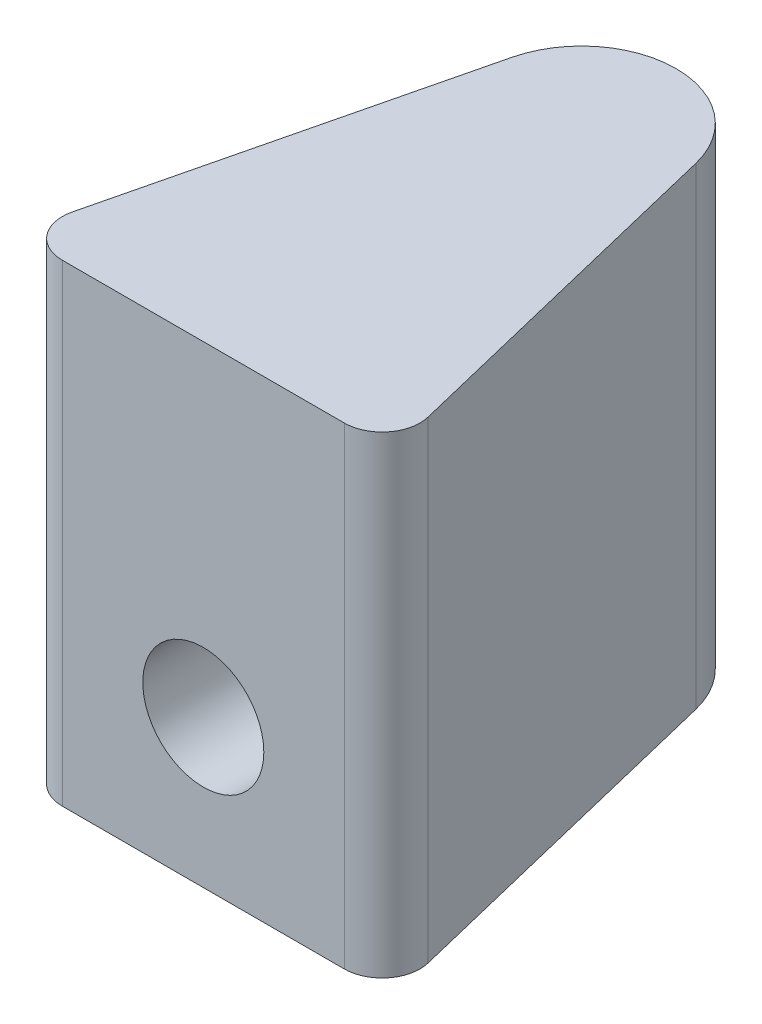
ISO-10303-21;
HEADER;
FILE_DESCRIPTION(('STEP AP214'),'2;1');
FILE_NAME('part.step','',(''),(''),'','','');
FILE_SCHEMA(('AUTOMOTIVE_DESIGN { 1 0 10303 214 1 1 1 1 }'));
ENDSEC;
DATA;
#1=APPLICATION_CONTEXT('core data for automotive mechanical design processes');
#2=APPLICATION_PROTOCOL_DEFINITION('international standard','automotive_design',2000,#1);
#3=PRODUCT_CONTEXT('',#1,'mechanical');
#4=PRODUCT('Part','Part','',(#3));
#5=PRODUCT_RELATED_PRODUCT_CATEGORY('part','',(#4));
#6=PRODUCT_DEFINITION_FORMATION('','',#4);
#7=PRODUCT_DEFINITION_CONTEXT('part definition',#1,'design');
#8=PRODUCT_DEFINITION('design','',#6,#7);
#9=PRODUCT_DEFINITION_SHAPE('','',#8);
#10=(LENGTH_UNIT() NAMED_UNIT(*) SI_UNIT(.MILLI.,.METRE.));
#11=(NAMED_UNIT(*) PLANE_ANGLE_UNIT() SI_UNIT($,.RADIAN.));
#12=(NAMED_UNIT(*) SI_UNIT($,.STERADIAN.) SOLID_ANGLE_UNIT());
#13=UNCERTAINTY_MEASURE_WITH_UNIT(LENGTH_MEASURE(1.E-05),#10,'distance_accuracy_value','');
#14=(GEOMETRIC_REPRESENTATION_CONTEXT(3) GLOBAL_UNCERTAINTY_ASSIGNED_CONTEXT((#13)) GLOBAL_UNIT_ASSIGNED_CONTEXT((#10,
#11,#12)) REPRESENTATION_CONTEXT('',''));
#15=CARTESIAN_POINT('',(0.,0.,0.));
#16=DIRECTION('',(0.,0.,1.));
#17=DIRECTION('',(1.,0.,0.));
#18=AXIS2_PLACEMENT_3D('',#15,#16,#17);
#19=CARTESIAN_POINT('',(0.,25.,0.));
#20=DIRECTION('',(0.,-1.,0.));
#21=DIRECTION('',(0.,0.,-1.));
#22=AXIS2_PLACEMENT_3D('',#19,#20,#21);
#23=CYLINDRICAL_SURFACE('',#22,5.);
#24=CARTESIAN_POINT('',(0.,0.,0.));
#25=DIRECTION('',(0.,1.,0.));
#26=DIRECTION('',(0.,0.,1.));
#27=AXIS2_PLACEMENT_3D('',#24,#25,#26);
#28=CIRCLE('',#27,5.);
#29=CARTESIAN_POINT('',(4.85889894354068,0.,-1.17944947177034));
#30=VERTEX_POINT('',#29);
#31=CARTESIAN_POINT('',(-4.85889894354068,0.,-1.17944947177034));
#32=VERTEX_POINT('',#31);
#33=EDGE_CURVE('E115',#30,#32,#28,.T.);
#34=ORIENTED_EDGE('',*,*,#33,.T.);
#35=DIRECTION('',(0.,-1.,0.));
#36=VECTOR('',#35,1.);
#37=CARTESIAN_POINT('',(-4.85889894354068,25.,-1.17944947177034));
#38=LINE('',#37,#36);
#39=CARTESIAN_POINT('',(-4.85889894354068,25.,-1.17944947177034));
#40=VERTEX_POINT('',#39);
#41=EDGE_CURVE('E96',#40,#32,#38,.T.);
#42=ORIENTED_EDGE('',*,*,#41,.F.);
#43=CARTESIAN_POINT('',(0.,25.,0.));
#44=DIRECTION('',(0.,1.,0.));
#45=DIRECTION('',(0.,0.,1.));
#46=AXIS2_PLACEMENT_3D('',#43,#44,#45);
#47=CIRCLE('',#46,5.);
#48=CARTESIAN_POINT('',(4.85889894354068,25.,-1.17944947177034));
#49=VERTEX_POINT('',#48);
#50=EDGE_CURVE('E102',#49,#40,#47,.T.);
#51=ORIENTED_EDGE('',*,*,#50,.F.);
#52=DIRECTION('',(0.,-1.,0.));
#53=VECTOR('',#52,1.);
#54=CARTESIAN_POINT('',(4.85889894354068,25.,-1.17944947177034));
#55=LINE('',#54,#53);
#56=EDGE_CURVE('E118',#49,#30,#55,.T.);
#57=ORIENTED_EDGE('',*,*,#56,.T.);
#58=EDGE_LOOP('',(#34,#42,#51,#57));
#59=FACE_BOUND('',#58,.T.);
#60=ADVANCED_FACE('F39',(#59),#23,.T.);
#61=CARTESIAN_POINT('',(-4.85889894354068,25.,-1.17944947177034));
#62=DIRECTION('',(0.971779788708135,0.,0.235889894354067));
#63=DIRECTION('',(0.235889894354067,0.,-0.971779788708135));
#64=AXIS2_PLACEMENT_3D('',#61,#62,#63);
#65=PLANE('',#64);
#66=DIRECTION('',(-0.235889894354067,0.,0.971779788708135));
#67=VECTOR('',#66,1.);
#68=CARTESIAN_POINT('',(-4.85889894354068,0.,-1.17944947177034));
#69=LINE('',#68,#67);
#70=CARTESIAN_POINT('',(-9.4,0.,17.5282202112919));
#71=VERTEX_POINT('',#70);
#72=EDGE_CURVE('E158',#32,#71,#69,.T.);
#73=ORIENTED_EDGE('',*,*,#72,.T.);
#74=DIRECTION('',(0.,-1.,0.));
#75=VECTOR('',#74,1.);
#76=CARTESIAN_POINT('',(-9.4,25.,17.5282202112919));
#77=LINE('',#76,#75);
#78=CARTESIAN_POINT('',(-9.4,25.,17.5282202112919));
#79=VERTEX_POINT('',#78);
#80=EDGE_CURVE('E11',#71,#79,#77,.F.);
#81=ORIENTED_EDGE('',*,*,#80,.T.);
#82=DIRECTION('',(-0.235889894354067,0.,0.971779788708135));
#83=VECTOR('',#82,1.);
#84=CARTESIAN_POINT('',(-4.85889894354068,25.,-1.17944947177034));
#85=LINE('',#84,#83);
#86=EDGE_CURVE('E92',#40,#79,#85,.T.);
#87=ORIENTED_EDGE('',*,*,#86,.F.);
#88=ORIENTED_EDGE('',*,*,#41,.T.);
#89=EDGE_LOOP('',(#73,#81,#87,#88));
#90=FACE_BOUND('',#89,.T.);
#91=ADVANCED_FACE('F94',(#90),#65,.F.);
#92=CARTESIAN_POINT('',(-10.,25.,20.));
#93=DIRECTION('',(0.,0.,-1.));
#94=DIRECTION('',(-1.,0.,0.));
#95=AXIS2_PLACEMENT_3D('',#92,#93,#94);
#96=PLANE('',#95);
#97=CARTESIAN_POINT('',(0.,7.8,20.));
#98=DIRECTION('',(0.,0.,1.));
#99=DIRECTION('',(1.,0.,0.));
#100=AXIS2_PLACEMENT_3D('',#97,#98,#99);
#101=CIRCLE('',#100,3.2);
#102=CARTESIAN_POINT('',(3.2,7.8,20.));
#103=VERTEX_POINT('',#102);
#104=EDGE_CURVE('E169',#103,#103,#101,.T.);
#105=ORIENTED_EDGE('',*,*,#104,.F.);
#106=EDGE_LOOP('',(#105));
#107=FACE_BOUND('',#106,.T.);
#108=DIRECTION('',(1.,0.,0.));
#109=VECTOR('',#108,1.);
#110=CARTESIAN_POINT('',(-10.,0.,20.));
#111=LINE('',#110,#109);
#112=CARTESIAN_POINT('',(-7.45644042258373,0.,20.));
#113=VERTEX_POINT('',#112);
#114=CARTESIAN_POINT('',(7.45644042258373,0.,20.));
#115=VERTEX_POINT('',#114);
#116=EDGE_CURVE('E154',#113,#115,#111,.T.);
#117=ORIENTED_EDGE('',*,*,#116,.T.);
#118=DIRECTION('',(0.,-1.,0.));
#119=VECTOR('',#118,1.);
#120=CARTESIAN_POINT('',(7.45644042258373,25.,20.));
#121=LINE('',#120,#119);
#122=CARTESIAN_POINT('',(7.45644042258373,25.,20.));
#123=VERTEX_POINT('',#122);
#124=EDGE_CURVE('E61',#115,#123,#121,.F.);
#125=ORIENTED_EDGE('',*,*,#124,.T.);
#126=DIRECTION('',(1.,0.,0.));
#127=VECTOR('',#126,1.);
#128=CARTESIAN_POINT('',(-10.,25.,20.));
#129=LINE('',#128,#127);
#130=CARTESIAN_POINT('',(-7.45644042258373,25.,20.));
#131=VERTEX_POINT('',#130);
#132=EDGE_CURVE('E101',#131,#123,#129,.T.);
#133=ORIENTED_EDGE('',*,*,#132,.F.);
#134=DIRECTION('',(0.,-1.,0.));
#135=VECTOR('',#134,1.);
#136=CARTESIAN_POINT('',(-7.45644042258373,25.,20.));
#137=LINE('',#136,#135);
#138=EDGE_CURVE('E133',#131,#113,#137,.T.);
#139=ORIENTED_EDGE('',*,*,#138,.T.);
#140=EDGE_LOOP('',(#117,#125,#133,#139));
#141=FACE_BOUND('',#140,.T.);
#142=ADVANCED_FACE('F155',(#107,#141),#96,.F.);
#143=CARTESIAN_POINT('',(10.,25.,20.));
#144=DIRECTION('',(-0.971779788708135,0.,0.235889894354067));
#145=DIRECTION('',(0.235889894354067,0.,0.971779788708135));
#146=AXIS2_PLACEMENT_3D('',#143,#144,#145);
#147=PLANE('',#146);
#148=DIRECTION('',(-0.235889894354067,0.,-0.971779788708135));
#149=VECTOR('',#148,1.);
#150=CARTESIAN_POINT('',(10.,25.,20.));
#151=LINE('',#150,#149);
#152=CARTESIAN_POINT('',(9.4,25.,17.5282202112919));
#153=VERTEX_POINT('',#152);
#154=EDGE_CURVE('E107',#153,#49,#151,.T.);
#155=ORIENTED_EDGE('',*,*,#154,.F.);
#156=DIRECTION('',(0.,-1.,0.));
#157=VECTOR('',#156,1.);
#158=CARTESIAN_POINT('',(9.4,25.,17.5282202112919));
#159=LINE('',#158,#157);
#160=CARTESIAN_POINT('',(9.4,0.,17.5282202112919));
#161=VERTEX_POINT('',#160);
#162=EDGE_CURVE('E117',#153,#161,#159,.T.);
#163=ORIENTED_EDGE('',*,*,#162,.T.);
#164=DIRECTION('',(-0.235889894354067,0.,-0.971779788708135));
#165=VECTOR('',#164,1.);
#166=CARTESIAN_POINT('',(10.,0.,20.));
#167=LINE('',#166,#165);
#168=EDGE_CURVE('E112',#161,#30,#167,.T.);
#169=ORIENTED_EDGE('',*,*,#168,.T.);
#170=ORIENTED_EDGE('',*,*,#56,.F.);
#171=EDGE_LOOP('',(#155,#163,#169,#170));
#172=FACE_BOUND('',#171,.T.);
#173=ADVANCED_FACE('F146',(#172),#147,.F.);
#174=CARTESIAN_POINT('',(0.,25.,0.));
#175=DIRECTION('',(0.,1.,0.));
#176=DIRECTION('',(0.,0.,1.));
#177=AXIS2_PLACEMENT_3D('',#174,#175,#176);
#178=PLANE('',#177);
#179=ORIENTED_EDGE('',*,*,#132,.T.);
#180=CARTESIAN_POINT('',(7.45644042258373,25.,18.));
#181=DIRECTION('',(0.,1.,0.));
#182=DIRECTION('',(0.,0.,1.));
#183=AXIS2_PLACEMENT_3D('',#180,#181,#182);
#184=CIRCLE('',#183,2.);
#185=EDGE_CURVE('E48',#123,#153,#184,.T.);
#186=ORIENTED_EDGE('',*,*,#185,.T.);
#187=ORIENTED_EDGE('',*,*,#154,.T.);
#188=ORIENTED_EDGE('',*,*,#50,.T.);
#189=ORIENTED_EDGE('',*,*,#86,.T.);
#190=CARTESIAN_POINT('',(-7.45644042258373,25.,18.));
#191=DIRECTION('',(0.,1.,0.));
#192=DIRECTION('',(0.,0.,1.));
#193=AXIS2_PLACEMENT_3D('',#190,#191,#192);
#194=CIRCLE('',#193,2.);
#195=EDGE_CURVE('E139',#79,#131,#194,.T.);
#196=ORIENTED_EDGE('',*,*,#195,.T.);
#197=EDGE_LOOP('',(#179,#186,#187,#188,#189,#196));
#198=FACE_BOUND('',#197,.T.);
#199=ADVANCED_FACE('F105',(#198),#178,.T.);
#200=CARTESIAN_POINT('',(0.,0.,0.));
#201=DIRECTION('',(0.,1.,0.));
#202=DIRECTION('',(0.,0.,1.));
#203=AXIS2_PLACEMENT_3D('',#200,#201,#202);
#204=PLANE('',#203);
#205=ORIENTED_EDGE('',*,*,#168,.F.);
#206=CARTESIAN_POINT('',(7.45644042258373,0.,18.));
#207=DIRECTION('',(0.,1.,0.));
#208=DIRECTION('',(0.,0.,1.));
#209=AXIS2_PLACEMENT_3D('',#206,#207,#208);
#210=CIRCLE('',#209,2.);
#211=EDGE_CURVE('E130',#161,#115,#210,.F.);
#212=ORIENTED_EDGE('',*,*,#211,.T.);
#213=ORIENTED_EDGE('',*,*,#116,.F.);
#214=CARTESIAN_POINT('',(-7.45644042258373,0.,18.));
#215=DIRECTION('',(0.,1.,0.));
#216=DIRECTION('',(0.,0.,1.));
#217=AXIS2_PLACEMENT_3D('',#214,#215,#216);
#218=CIRCLE('',#217,2.);
#219=EDGE_CURVE('E123',#113,#71,#218,.F.);
#220=ORIENTED_EDGE('',*,*,#219,.T.);
#221=ORIENTED_EDGE('',*,*,#72,.F.);
#222=ORIENTED_EDGE('',*,*,#33,.F.);
#223=EDGE_LOOP('',(#205,#212,#213,#220,#221,#222));
#224=FACE_BOUND('',#223,.T.);
#225=ADVANCED_FACE('F153',(#224),#204,.F.);
#226=CARTESIAN_POINT('',(0.,7.8,8.));
#227=DIRECTION('',(0.,0.,1.));
#228=DIRECTION('',(1.,0.,0.));
#229=AXIS2_PLACEMENT_3D('',#226,#227,#228);
#230=CYLINDRICAL_SURFACE('',#229,3.2);
#231=CARTESIAN_POINT('',(0.,7.8,8.));
#232=DIRECTION('',(0.,0.,1.));
#233=DIRECTION('',(1.,0.,0.));
#234=AXIS2_PLACEMENT_3D('',#231,#232,#233);
#235=CIRCLE('',#234,3.2);
#236=CARTESIAN_POINT('',(3.2,7.8,8.));
#237=VERTEX_POINT('',#236);
#238=EDGE_CURVE('E165',#237,#237,#235,.T.);
#239=ORIENTED_EDGE('',*,*,#238,.F.);
#240=EDGE_LOOP('',(#239));
#241=FACE_BOUND('',#240,.T.);
#242=ORIENTED_EDGE('',*,*,#104,.T.);
#243=EDGE_LOOP('',(#242));
#244=FACE_BOUND('',#243,.T.);
#245=ADVANCED_FACE('F179',(#241,#244),#230,.F.);
#246=CARTESIAN_POINT('',(0.,7.8,8.));
#247=DIRECTION('',(0.,0.,1.));
#248=DIRECTION('',(1.,0.,0.));
#249=AXIS2_PLACEMENT_3D('',#246,#247,#248);
#250=PLANE('',#249);
#251=ORIENTED_EDGE('',*,*,#238,.T.);
#252=EDGE_LOOP('',(#251));
#253=FACE_BOUND('',#252,.T.);
#254=ADVANCED_FACE('F177',(#253),#250,.T.);
#255=CARTESIAN_POINT('',(7.45644042258373,25.,18.));
#256=DIRECTION('',(0.,-1.,0.));
#257=DIRECTION('',(0.,0.,-1.));
#258=AXIS2_PLACEMENT_3D('',#255,#256,#257);
#259=CYLINDRICAL_SURFACE('',#258,2.);
#260=ORIENTED_EDGE('',*,*,#185,.F.);
#261=ORIENTED_EDGE('',*,*,#124,.F.);
#262=ORIENTED_EDGE('',*,*,#211,.F.);
#263=ORIENTED_EDGE('',*,*,#162,.F.);
#264=EDGE_LOOP('',(#260,#261,#262,#263));
#265=FACE_BOUND('',#264,.T.);
#266=ADVANCED_FACE('F150',(#265),#259,.T.);
#267=CARTESIAN_POINT('',(-7.45644042258373,25.,18.));
#268=DIRECTION('',(0.,-1.,0.));
#269=DIRECTION('',(0.,0.,-1.));
#270=AXIS2_PLACEMENT_3D('',#267,#268,#269);
#271=CYLINDRICAL_SURFACE('',#270,2.);
#272=ORIENTED_EDGE('',*,*,#195,.F.);
#273=ORIENTED_EDGE('',*,*,#80,.F.);
#274=ORIENTED_EDGE('',*,*,#219,.F.);
#275=ORIENTED_EDGE('',*,*,#138,.F.);
#276=EDGE_LOOP('',(#272,#273,#274,#275));
#277=FACE_BOUND('',#276,.T.);
#278=ADVANCED_FACE('F41',(#277),#271,.T.);
#279=CLOSED_SHELL('',(#60,#91,#142,#173,#199,#225,#245,#254,#266,#278));
#280=MANIFOLD_SOLID_BREP('B2',#279);
#281=ADVANCED_BREP_SHAPE_REPRESENTATION('',(#18,#280),#14);
#282=SHAPE_DEFINITION_REPRESENTATION(#9,#281);
ENDSEC;
END-ISO-10303-21;
